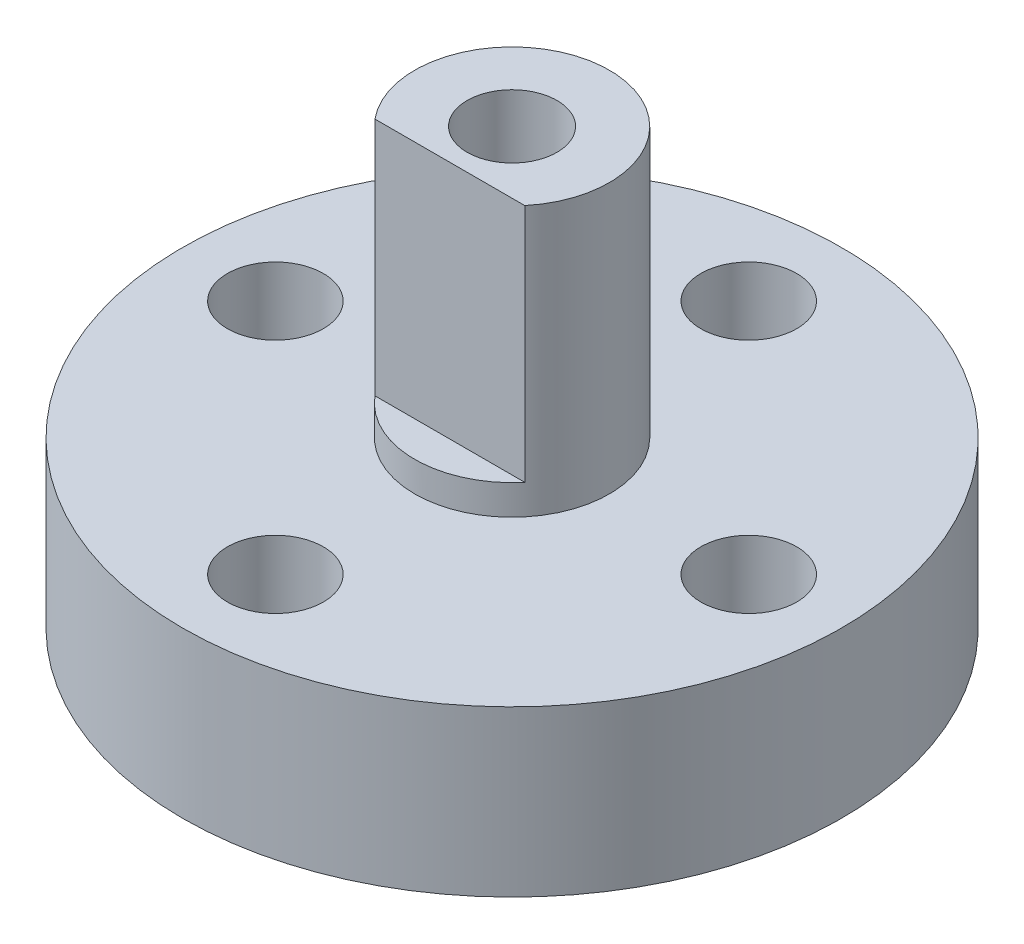
ISO-10303-21;
HEADER;
FILE_DESCRIPTION(('STEP AP214'),'2;1');
FILE_NAME('part.step','',(''),(''),'','','');
FILE_SCHEMA(('AUTOMOTIVE_DESIGN { 1 0 10303 214 1 1 1 1 }'));
ENDSEC;
DATA;
#1=APPLICATION_CONTEXT('core data for automotive mechanical design processes');
#2=APPLICATION_PROTOCOL_DEFINITION('international standard','automotive_design',2000,#1);
#3=PRODUCT_CONTEXT('',#1,'mechanical');
#4=PRODUCT('Part','Part','',(#3));
#5=PRODUCT_RELATED_PRODUCT_CATEGORY('part','',(#4));
#6=PRODUCT_DEFINITION_FORMATION('','',#4);
#7=PRODUCT_DEFINITION_CONTEXT('part definition',#1,'design');
#8=PRODUCT_DEFINITION('design','',#6,#7);
#9=PRODUCT_DEFINITION_SHAPE('','',#8);
#10=(LENGTH_UNIT() NAMED_UNIT(*) SI_UNIT(.MILLI.,.METRE.));
#11=(NAMED_UNIT(*) PLANE_ANGLE_UNIT() SI_UNIT($,.RADIAN.));
#12=(NAMED_UNIT(*) SI_UNIT($,.STERADIAN.) SOLID_ANGLE_UNIT());
#13=UNCERTAINTY_MEASURE_WITH_UNIT(LENGTH_MEASURE(1.E-05),#10,'distance_accuracy_value','');
#14=(GEOMETRIC_REPRESENTATION_CONTEXT(3) GLOBAL_UNCERTAINTY_ASSIGNED_CONTEXT((#13)) GLOBAL_UNIT_ASSIGNED_CONTEXT((#10,
#11,#12)) REPRESENTATION_CONTEXT('',''));
#15=CARTESIAN_POINT('',(0.,0.,0.));
#16=DIRECTION('',(0.,0.,1.));
#17=DIRECTION('',(1.,0.,0.));
#18=AXIS2_PLACEMENT_3D('',#15,#16,#17);
#19=CARTESIAN_POINT('',(0.,5.5,0.));
#20=DIRECTION('',(0.,1.,0.));
#21=DIRECTION('',(0.,0.,1.));
#22=AXIS2_PLACEMENT_3D('',#19,#20,#21);
#23=PLANE('',#22);
#24=CARTESIAN_POINT('',(0.,5.5,0.));
#25=DIRECTION('',(0.,1.,0.));
#26=DIRECTION('',(0.,0.,1.));
#27=AXIS2_PLACEMENT_3D('',#24,#25,#26);
#28=CIRCLE('',#27,3.25);
#29=CARTESIAN_POINT('',(0.,5.5,3.25));
#30=VERTEX_POINT('',#29);
#31=EDGE_CURVE('E98',#30,#30,#28,.T.);
#32=ORIENTED_EDGE('',*,*,#31,.F.);
#33=EDGE_LOOP('',(#32));
#34=FACE_BOUND('',#33,.T.);
#35=CARTESIAN_POINT('',(0.,5.5,7.9));
#36=DIRECTION('',(0.,1.,0.));
#37=DIRECTION('',(0.,0.,1.));
#38=AXIS2_PLACEMENT_3D('',#35,#36,#37);
#39=CIRCLE('',#38,1.6);
#40=CARTESIAN_POINT('',(0.,5.5,9.5));
#41=VERTEX_POINT('',#40);
#42=EDGE_CURVE('E114',#41,#41,#39,.T.);
#43=ORIENTED_EDGE('',*,*,#42,.F.);
#44=EDGE_LOOP('',(#43));
#45=FACE_BOUND('',#44,.T.);
#46=CARTESIAN_POINT('',(0.,5.5,-7.9));
#47=DIRECTION('',(0.,1.,0.));
#48=DIRECTION('',(0.,0.,1.));
#49=AXIS2_PLACEMENT_3D('',#46,#47,#48);
#50=CIRCLE('',#49,1.6);
#51=CARTESIAN_POINT('',(0.,5.5,-6.3));
#52=VERTEX_POINT('',#51);
#53=EDGE_CURVE('E130',#52,#52,#50,.T.);
#54=ORIENTED_EDGE('',*,*,#53,.F.);
#55=EDGE_LOOP('',(#54));
#56=FACE_BOUND('',#55,.T.);
#57=CARTESIAN_POINT('',(0.,5.5,0.));
#58=DIRECTION('',(0.,1.,0.));
#59=DIRECTION('',(0.,0.,1.));
#60=AXIS2_PLACEMENT_3D('',#57,#58,#59);
#61=CIRCLE('',#60,11.);
#62=CARTESIAN_POINT('',(0.,5.5,11.));
#63=VERTEX_POINT('',#62);
#64=EDGE_CURVE('E138',#63,#63,#61,.T.);
#65=ORIENTED_EDGE('',*,*,#64,.T.);
#66=EDGE_LOOP('',(#65));
#67=FACE_BOUND('',#66,.T.);
#68=CARTESIAN_POINT('',(7.9,5.5,0.));
#69=DIRECTION('',(0.,1.,0.));
#70=DIRECTION('',(0.,0.,1.));
#71=AXIS2_PLACEMENT_3D('',#68,#69,#70);
#72=CIRCLE('',#71,1.6);
#73=CARTESIAN_POINT('',(7.9,5.5,1.6));
#74=VERTEX_POINT('',#73);
#75=EDGE_CURVE('E122',#74,#74,#72,.T.);
#76=ORIENTED_EDGE('',*,*,#75,.F.);
#77=EDGE_LOOP('',(#76));
#78=FACE_BOUND('',#77,.T.);
#79=CARTESIAN_POINT('',(-7.9,5.5,0.));
#80=DIRECTION('',(0.,1.,0.));
#81=DIRECTION('',(0.,0.,1.));
#82=AXIS2_PLACEMENT_3D('',#79,#80,#81);
#83=CIRCLE('',#82,1.6);
#84=CARTESIAN_POINT('',(-7.9,5.5,1.6));
#85=VERTEX_POINT('',#84);
#86=EDGE_CURVE('E103',#85,#85,#83,.T.);
#87=ORIENTED_EDGE('',*,*,#86,.F.);
#88=EDGE_LOOP('',(#87));
#89=FACE_BOUND('',#88,.T.);
#90=ADVANCED_FACE('F50',(#34,#45,#56,#67,#78,#89),#23,.T.);
#91=CARTESIAN_POINT('',(0.,0.,0.));
#92=DIRECTION('',(0.,1.,0.));
#93=DIRECTION('',(0.,0.,1.));
#94=AXIS2_PLACEMENT_3D('',#91,#92,#93);
#95=PLANE('',#94);
#96=CARTESIAN_POINT('',(0.,0.,0.));
#97=DIRECTION('',(0.,1.,0.));
#98=DIRECTION('',(0.,0.,1.));
#99=AXIS2_PLACEMENT_3D('',#96,#97,#98);
#100=CIRCLE('',#99,2.75000000000001);
#101=CARTESIAN_POINT('',(0.,0.,2.75000000000001));
#102=VERTEX_POINT('',#101);
#103=EDGE_CURVE('E60',#102,#102,#100,.T.);
#104=ORIENTED_EDGE('',*,*,#103,.T.);
#105=EDGE_LOOP('',(#104));
#106=FACE_BOUND('',#105,.T.);
#107=CARTESIAN_POINT('',(0.,0.,0.));
#108=DIRECTION('',(0.,1.,0.));
#109=DIRECTION('',(0.,0.,1.));
#110=AXIS2_PLACEMENT_3D('',#107,#108,#109);
#111=CIRCLE('',#110,11.);
#112=CARTESIAN_POINT('',(0.,0.,11.));
#113=VERTEX_POINT('',#112);
#114=EDGE_CURVE('E134',#113,#113,#111,.T.);
#115=ORIENTED_EDGE('',*,*,#114,.F.);
#116=EDGE_LOOP('',(#115));
#117=FACE_BOUND('',#116,.T.);
#118=CARTESIAN_POINT('',(0.,0.,-7.9));
#119=DIRECTION('',(0.,1.,0.));
#120=DIRECTION('',(0.,0.,1.));
#121=AXIS2_PLACEMENT_3D('',#118,#119,#120);
#122=CIRCLE('',#121,1.6);
#123=CARTESIAN_POINT('',(0.,0.,-6.3));
#124=VERTEX_POINT('',#123);
#125=EDGE_CURVE('E126',#124,#124,#122,.T.);
#126=ORIENTED_EDGE('',*,*,#125,.T.);
#127=EDGE_LOOP('',(#126));
#128=FACE_BOUND('',#127,.T.);
#129=CARTESIAN_POINT('',(7.9,0.,0.));
#130=DIRECTION('',(0.,1.,0.));
#131=DIRECTION('',(0.,0.,1.));
#132=AXIS2_PLACEMENT_3D('',#129,#130,#131);
#133=CIRCLE('',#132,1.6);
#134=CARTESIAN_POINT('',(7.9,0.,1.6));
#135=VERTEX_POINT('',#134);
#136=EDGE_CURVE('E118',#135,#135,#133,.T.);
#137=ORIENTED_EDGE('',*,*,#136,.T.);
#138=EDGE_LOOP('',(#137));
#139=FACE_BOUND('',#138,.T.);
#140=CARTESIAN_POINT('',(0.,0.,7.9));
#141=DIRECTION('',(0.,1.,0.));
#142=DIRECTION('',(0.,0.,1.));
#143=AXIS2_PLACEMENT_3D('',#140,#141,#142);
#144=CIRCLE('',#143,1.6);
#145=CARTESIAN_POINT('',(0.,0.,9.5));
#146=VERTEX_POINT('',#145);
#147=EDGE_CURVE('E112',#146,#146,#144,.T.);
#148=ORIENTED_EDGE('',*,*,#147,.T.);
#149=EDGE_LOOP('',(#148));
#150=FACE_BOUND('',#149,.T.);
#151=CARTESIAN_POINT('',(-7.9,0.,0.));
#152=DIRECTION('',(0.,1.,0.));
#153=DIRECTION('',(0.,0.,1.));
#154=AXIS2_PLACEMENT_3D('',#151,#152,#153);
#155=CIRCLE('',#154,1.6);
#156=CARTESIAN_POINT('',(-7.9,0.,1.6));
#157=VERTEX_POINT('',#156);
#158=EDGE_CURVE('E97',#157,#157,#155,.T.);
#159=ORIENTED_EDGE('',*,*,#158,.T.);
#160=EDGE_LOOP('',(#159));
#161=FACE_BOUND('',#160,.T.);
#162=ADVANCED_FACE('F148',(#106,#117,#128,#139,#150,#161),#95,.F.);
#163=CARTESIAN_POINT('',(0.,5.5,0.));
#164=DIRECTION('',(0.,-1.,0.));
#165=DIRECTION('',(0.,0.,-1.));
#166=AXIS2_PLACEMENT_3D('',#163,#164,#165);
#167=CYLINDRICAL_SURFACE('',#166,11.);
#168=ORIENTED_EDGE('',*,*,#64,.F.);
#169=EDGE_LOOP('',(#168));
#170=FACE_BOUND('',#169,.T.);
#171=ORIENTED_EDGE('',*,*,#114,.T.);
#172=EDGE_LOOP('',(#171));
#173=FACE_BOUND('',#172,.T.);
#174=ADVANCED_FACE('F169',(#170,#173),#167,.T.);
#175=CARTESIAN_POINT('',(0.,5.5,-7.9));
#176=DIRECTION('',(0.,-1.,0.));
#177=DIRECTION('',(0.,0.,-1.));
#178=AXIS2_PLACEMENT_3D('',#175,#176,#177);
#179=CYLINDRICAL_SURFACE('',#178,1.6);
#180=ORIENTED_EDGE('',*,*,#53,.T.);
#181=EDGE_LOOP('',(#180));
#182=FACE_BOUND('',#181,.T.);
#183=ORIENTED_EDGE('',*,*,#125,.F.);
#184=EDGE_LOOP('',(#183));
#185=FACE_BOUND('',#184,.T.);
#186=ADVANCED_FACE('F174',(#182,#185),#179,.F.);
#187=CARTESIAN_POINT('',(7.9,5.5,0.));
#188=DIRECTION('',(0.,-1.,0.));
#189=DIRECTION('',(0.,0.,-1.));
#190=AXIS2_PLACEMENT_3D('',#187,#188,#189);
#191=CYLINDRICAL_SURFACE('',#190,1.6);
#192=ORIENTED_EDGE('',*,*,#75,.T.);
#193=EDGE_LOOP('',(#192));
#194=FACE_BOUND('',#193,.T.);
#195=ORIENTED_EDGE('',*,*,#136,.F.);
#196=EDGE_LOOP('',(#195));
#197=FACE_BOUND('',#196,.T.);
#198=ADVANCED_FACE('F181',(#194,#197),#191,.F.);
#199=CARTESIAN_POINT('',(0.,5.5,7.9));
#200=DIRECTION('',(0.,-1.,0.));
#201=DIRECTION('',(0.,0.,-1.));
#202=AXIS2_PLACEMENT_3D('',#199,#200,#201);
#203=CYLINDRICAL_SURFACE('',#202,1.6);
#204=ORIENTED_EDGE('',*,*,#42,.T.);
#205=EDGE_LOOP('',(#204));
#206=FACE_BOUND('',#205,.T.);
#207=ORIENTED_EDGE('',*,*,#147,.F.);
#208=EDGE_LOOP('',(#207));
#209=FACE_BOUND('',#208,.T.);
#210=ADVANCED_FACE('F196',(#206,#209),#203,.F.);
#211=CARTESIAN_POINT('',(-7.9,5.5,0.));
#212=DIRECTION('',(0.,-1.,0.));
#213=DIRECTION('',(0.,0.,-1.));
#214=AXIS2_PLACEMENT_3D('',#211,#212,#213);
#215=CYLINDRICAL_SURFACE('',#214,1.6);
#216=ORIENTED_EDGE('',*,*,#86,.T.);
#217=EDGE_LOOP('',(#216));
#218=FACE_BOUND('',#217,.T.);
#219=ORIENTED_EDGE('',*,*,#158,.F.);
#220=EDGE_LOOP('',(#219));
#221=FACE_BOUND('',#220,.T.);
#222=ADVANCED_FACE('F195',(#218,#221),#215,.F.);
#223=CARTESIAN_POINT('',(0.,14.5,0.));
#224=DIRECTION('',(0.,-1.,0.));
#225=DIRECTION('',(0.,0.,-1.));
#226=AXIS2_PLACEMENT_3D('',#223,#224,#225);
#227=CYLINDRICAL_SURFACE('',#226,3.25);
#228=CARTESIAN_POINT('',(0.,14.5,0.));
#229=DIRECTION('',(0.,1.,0.));
#230=DIRECTION('',(0.,0.,1.));
#231=AXIS2_PLACEMENT_3D('',#228,#229,#230);
#232=CIRCLE('',#231,3.25);
#233=CARTESIAN_POINT('',(2.5,14.5,2.07665596572952));
#234=VERTEX_POINT('',#233);
#235=CARTESIAN_POINT('',(-2.5,14.5,2.07665596572952));
#236=VERTEX_POINT('',#235);
#237=EDGE_CURVE('E91',#234,#236,#232,.T.);
#238=ORIENTED_EDGE('',*,*,#237,.F.);
#239=DIRECTION('',(0.,1.,0.));
#240=VECTOR('',#239,1.);
#241=CARTESIAN_POINT('',(2.5,0.364171320735265,2.07665596572952));
#242=LINE('',#241,#240);
#243=CARTESIAN_POINT('',(2.5,6.5,2.07665596572952));
#244=VERTEX_POINT('',#243);
#245=EDGE_CURVE('E67',#244,#234,#242,.T.);
#246=ORIENTED_EDGE('',*,*,#245,.F.);
#247=CARTESIAN_POINT('',(0.,6.5,0.));
#248=DIRECTION('',(0.,1.,0.));
#249=DIRECTION('',(0.,0.,1.));
#250=AXIS2_PLACEMENT_3D('',#247,#248,#249);
#251=CIRCLE('',#250,3.25);
#252=CARTESIAN_POINT('',(-2.5,6.5,2.07665596572952));
#253=VERTEX_POINT('',#252);
#254=EDGE_CURVE('E92',#244,#253,#251,.F.);
#255=ORIENTED_EDGE('',*,*,#254,.T.);
#256=DIRECTION('',(0.,1.,0.));
#257=VECTOR('',#256,1.);
#258=CARTESIAN_POINT('',(-2.5,0.364171320735265,2.07665596572952));
#259=LINE('',#258,#257);
#260=EDGE_CURVE('E80',#253,#236,#259,.T.);
#261=ORIENTED_EDGE('',*,*,#260,.T.);
#262=EDGE_LOOP('',(#238,#246,#255,#261));
#263=FACE_BOUND('',#262,.T.);
#264=ORIENTED_EDGE('',*,*,#31,.T.);
#265=EDGE_LOOP('',(#264));
#266=FACE_BOUND('',#265,.T.);
#267=ADVANCED_FACE('F89',(#263,#266),#227,.T.);
#268=CARTESIAN_POINT('',(0.,14.5,0.));
#269=DIRECTION('',(0.,1.,0.));
#270=DIRECTION('',(0.,0.,1.));
#271=AXIS2_PLACEMENT_3D('',#268,#269,#270);
#272=PLANE('',#271);
#273=CARTESIAN_POINT('',(0.,14.5,0.));
#274=DIRECTION('',(0.,1.,0.));
#275=DIRECTION('',(0.,0.,1.));
#276=AXIS2_PLACEMENT_3D('',#273,#274,#275);
#277=CIRCLE('',#276,1.5);
#278=CARTESIAN_POINT('',(0.,14.5,1.5));
#279=VERTEX_POINT('',#278);
#280=EDGE_CURVE('E85',#279,#279,#277,.T.);
#281=ORIENTED_EDGE('',*,*,#280,.F.);
#282=EDGE_LOOP('',(#281));
#283=FACE_BOUND('',#282,.T.);
#284=DIRECTION('',(-1.,0.,0.));
#285=VECTOR('',#284,1.);
#286=CARTESIAN_POINT('',(2.5,14.5,2.07665596572952));
#287=LINE('',#286,#285);
#288=EDGE_CURVE('E77',#234,#236,#287,.T.);
#289=ORIENTED_EDGE('',*,*,#288,.F.);
#290=ORIENTED_EDGE('',*,*,#237,.T.);
#291=EDGE_LOOP('',(#289,#290));
#292=FACE_BOUND('',#291,.T.);
#293=ADVANCED_FACE('F95',(#283,#292),#272,.T.);
#294=CARTESIAN_POINT('',(2.5,0.364171320735265,2.07665596572952));
#295=DIRECTION('',(0.,0.,-1.));
#296=DIRECTION('',(-1.,0.,0.));
#297=AXIS2_PLACEMENT_3D('',#294,#295,#296);
#298=PLANE('',#297);
#299=DIRECTION('',(1.,0.,0.));
#300=VECTOR('',#299,1.);
#301=CARTESIAN_POINT('',(2.5,6.5,2.07665596572952));
#302=LINE('',#301,#300);
#303=EDGE_CURVE('E72',#253,#244,#302,.T.);
#304=ORIENTED_EDGE('',*,*,#303,.T.);
#305=ORIENTED_EDGE('',*,*,#245,.T.);
#306=ORIENTED_EDGE('',*,*,#288,.T.);
#307=ORIENTED_EDGE('',*,*,#260,.F.);
#308=EDGE_LOOP('',(#304,#305,#306,#307));
#309=FACE_BOUND('',#308,.T.);
#310=ADVANCED_FACE('F79',(#309),#298,.F.);
#311=CARTESIAN_POINT('',(0.,6.5,0.));
#312=DIRECTION('',(0.,1.,0.));
#313=DIRECTION('',(0.,0.,1.));
#314=AXIS2_PLACEMENT_3D('',#311,#312,#313);
#315=PLANE('',#314);
#316=ORIENTED_EDGE('',*,*,#254,.F.);
#317=ORIENTED_EDGE('',*,*,#303,.F.);
#318=EDGE_LOOP('',(#316,#317));
#319=FACE_BOUND('',#318,.T.);
#320=ADVANCED_FACE('F157',(#319),#315,.T.);
#321=CARTESIAN_POINT('',(0.,0.,0.));
#322=DIRECTION('',(0.,1.,0.));
#323=DIRECTION('',(0.,0.,1.));
#324=AXIS2_PLACEMENT_3D('',#321,#322,#323);
#325=CYLINDRICAL_SURFACE('',#324,1.5);
#326=CARTESIAN_POINT('',(0.,0.721687836487033,0.));
#327=DIRECTION('',(0.,1.,0.));
#328=DIRECTION('',(0.,0.,1.));
#329=AXIS2_PLACEMENT_3D('',#326,#327,#328);
#330=CIRCLE('',#329,1.5);
#331=CARTESIAN_POINT('',(0.,0.721687836487033,1.5));
#332=VERTEX_POINT('',#331);
#333=EDGE_CURVE('E13',#332,#332,#330,.F.);
#334=ORIENTED_EDGE('',*,*,#333,.T.);
#335=EDGE_LOOP('',(#334));
#336=FACE_BOUND('',#335,.T.);
#337=ORIENTED_EDGE('',*,*,#280,.T.);
#338=EDGE_LOOP('',(#337));
#339=FACE_BOUND('',#338,.T.);
#340=ADVANCED_FACE('F152',(#336,#339),#325,.F.);
#341=CARTESIAN_POINT('',(0.,0.,0.));
#342=DIRECTION('',(0.,-1.,0.));
#343=DIRECTION('',(0.,0.,-1.));
#344=AXIS2_PLACEMENT_3D('',#341,#342,#343);
#345=CONICAL_SURFACE('',#344,2.75000000000001,1.0471975511966);
#346=ORIENTED_EDGE('',*,*,#333,.F.);
#347=EDGE_LOOP('',(#346));
#348=FACE_BOUND('',#347,.T.);
#349=ORIENTED_EDGE('',*,*,#103,.F.);
#350=EDGE_LOOP('',(#349));
#351=FACE_BOUND('',#350,.T.);
#352=ADVANCED_FACE('F53',(#348,#351),#345,.F.);
#353=CLOSED_SHELL('',(#90,#162,#174,#186,#198,#210,#222,#267,#293,#310,#320,#340,#352));
#354=MANIFOLD_SOLID_BREP('B2',#353);
#355=ADVANCED_BREP_SHAPE_REPRESENTATION('',(#18,#354),#14);
#356=SHAPE_DEFINITION_REPRESENTATION(#9,#355);
ENDSEC;
END-ISO-10303-21;
